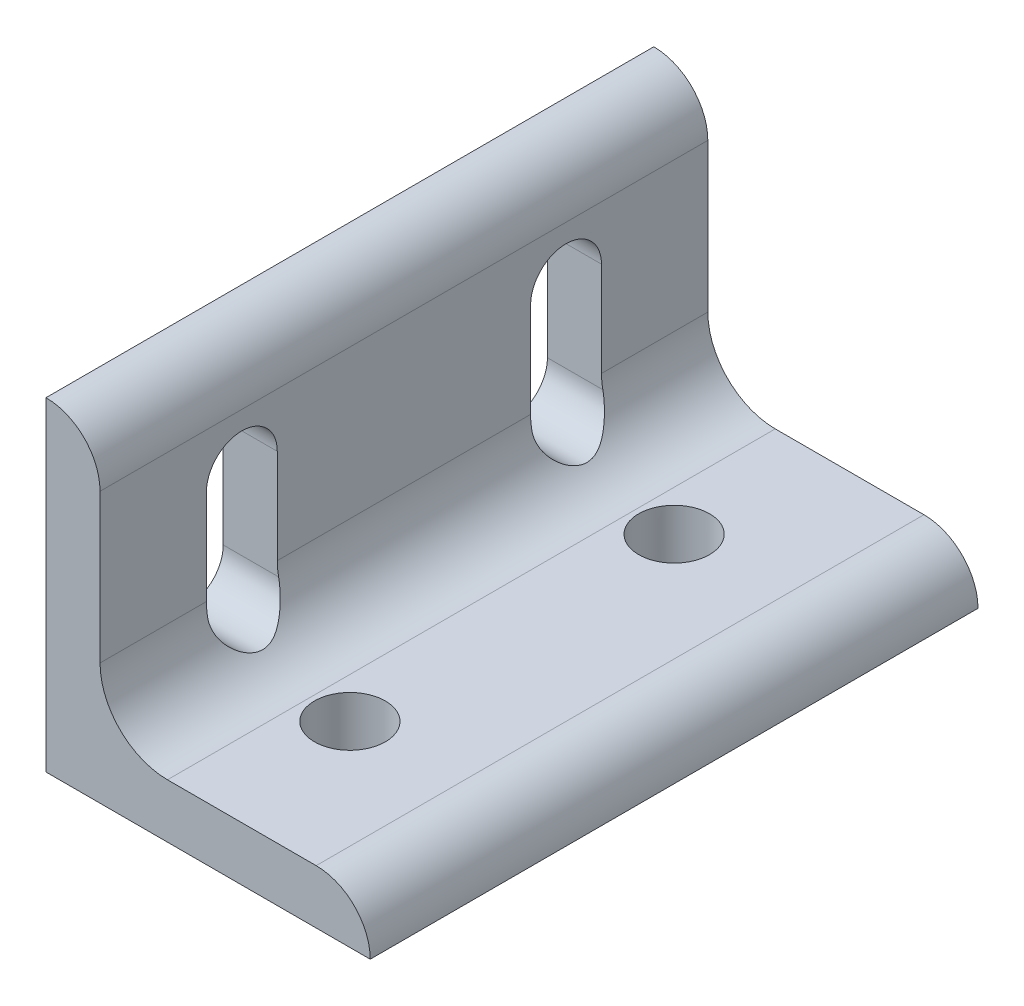
ISO-10303-21;
HEADER;
FILE_DESCRIPTION(('STEP AP214'),'2;1');
FILE_NAME('part.step','',(''),(''),'','','');
FILE_SCHEMA(('AUTOMOTIVE_DESIGN { 1 0 10303 214 1 1 1 1 }'));
ENDSEC;
DATA;
#1=APPLICATION_CONTEXT('core data for automotive mechanical design processes');
#2=APPLICATION_PROTOCOL_DEFINITION('international standard','automotive_design',2000,#1);
#3=PRODUCT_CONTEXT('',#1,'mechanical');
#4=PRODUCT('Part','Part','',(#3));
#5=PRODUCT_RELATED_PRODUCT_CATEGORY('part','',(#4));
#6=PRODUCT_DEFINITION_FORMATION('','',#4);
#7=PRODUCT_DEFINITION_CONTEXT('part definition',#1,'design');
#8=PRODUCT_DEFINITION('design','',#6,#7);
#9=PRODUCT_DEFINITION_SHAPE('','',#8);
#10=(LENGTH_UNIT() NAMED_UNIT(*) SI_UNIT(.MILLI.,.METRE.));
#11=(NAMED_UNIT(*) PLANE_ANGLE_UNIT() SI_UNIT($,.RADIAN.));
#12=(NAMED_UNIT(*) SI_UNIT($,.STERADIAN.) SOLID_ANGLE_UNIT());
#13=UNCERTAINTY_MEASURE_WITH_UNIT(LENGTH_MEASURE(1.E-05),#10,'distance_accuracy_value','');
#14=(GEOMETRIC_REPRESENTATION_CONTEXT(3) GLOBAL_UNCERTAINTY_ASSIGNED_CONTEXT((#13)) GLOBAL_UNIT_ASSIGNED_CONTEXT((#10,
#11,#12)) REPRESENTATION_CONTEXT('',''));
#15=CARTESIAN_POINT('',(0.,0.,0.));
#16=DIRECTION('',(0.,0.,1.));
#17=DIRECTION('',(1.,0.,0.));
#18=AXIS2_PLACEMENT_3D('',#15,#16,#17);
#19=CARTESIAN_POINT('',(38.1,0.,35.7124));
#20=DIRECTION('',(0.,1.,0.));
#21=DIRECTION('',(-1.,0.,0.));
#22=AXIS2_PLACEMENT_3D('',#19,#20,#21);
#23=PLANE('',#22);
#24=CARTESIAN_POINT('',(19.05,0.,-19.05));
#25=DIRECTION('',(0.,-1.,0.));
#26=DIRECTION('',(-1.,0.,0.));
#27=AXIS2_PLACEMENT_3D('',#24,#25,#26);
#28=CIRCLE('',#27,4.1656);
#29=CARTESIAN_POINT('',(14.8844,0.,-19.05));
#30=VERTEX_POINT('',#29);
#31=EDGE_CURVE('E449',#30,#30,#28,.T.);
#32=ORIENTED_EDGE('',*,*,#31,.F.);
#33=EDGE_LOOP('',(#32));
#34=FACE_BOUND('',#33,.T.);
#35=CARTESIAN_POINT('',(19.05,0.,19.05));
#36=DIRECTION('',(0.,-1.,0.));
#37=DIRECTION('',(1.,0.,0.));
#38=AXIS2_PLACEMENT_3D('',#35,#36,#37);
#39=CIRCLE('',#38,4.1656);
#40=CARTESIAN_POINT('',(23.2156,0.,19.05));
#41=VERTEX_POINT('',#40);
#42=EDGE_CURVE('E453',#41,#41,#39,.T.);
#43=ORIENTED_EDGE('',*,*,#42,.F.);
#44=EDGE_LOOP('',(#43));
#45=FACE_BOUND('',#44,.T.);
#46=DIRECTION('',(1.,0.,0.));
#47=VECTOR('',#46,1.);
#48=CARTESIAN_POINT('',(38.1,0.,-35.7124));
#49=LINE('',#48,#47);
#50=CARTESIAN_POINT('',(0.,0.,-35.7124));
#51=VERTEX_POINT('',#50);
#52=CARTESIAN_POINT('',(38.1,0.,-35.7124));
#53=VERTEX_POINT('',#52);
#54=EDGE_CURVE('E252',#51,#53,#49,.T.);
#55=ORIENTED_EDGE('',*,*,#54,.T.);
#56=DIRECTION('',(0.,0.,-1.));
#57=VECTOR('',#56,1.);
#58=CARTESIAN_POINT('',(38.1,0.,35.7124));
#59=LINE('',#58,#57);
#60=CARTESIAN_POINT('',(38.1,0.,35.7124));
#61=VERTEX_POINT('',#60);
#62=EDGE_CURVE('E290',#61,#53,#59,.T.);
#63=ORIENTED_EDGE('',*,*,#62,.F.);
#64=DIRECTION('',(1.,0.,0.));
#65=VECTOR('',#64,1.);
#66=CARTESIAN_POINT('',(38.1,0.,35.7124));
#67=LINE('',#66,#65);
#68=CARTESIAN_POINT('',(0.,0.,35.7124));
#69=VERTEX_POINT('',#68);
#70=EDGE_CURVE('E253',#69,#61,#67,.T.);
#71=ORIENTED_EDGE('',*,*,#70,.F.);
#72=DIRECTION('',(0.,0.,-1.));
#73=VECTOR('',#72,1.);
#74=CARTESIAN_POINT('',(0.,0.,35.7124));
#75=LINE('',#74,#73);
#76=EDGE_CURVE('E265',#69,#51,#75,.T.);
#77=ORIENTED_EDGE('',*,*,#76,.T.);
#78=EDGE_LOOP('',(#55,#63,#71,#77));
#79=FACE_BOUND('',#78,.T.);
#80=ADVANCED_FACE('F41',(#34,#45,#79),#23,.F.);
#81=CARTESIAN_POINT('',(14.2748,6.35,35.7124));
#82=DIRECTION('',(0.,-1.,0.));
#83=DIRECTION('',(1.,0.,0.));
#84=AXIS2_PLACEMENT_3D('',#81,#82,#83);
#85=PLANE('',#84);
#86=CARTESIAN_POINT('',(19.05,6.35,-19.05));
#87=DIRECTION('',(0.,-1.,0.));
#88=DIRECTION('',(1.,0.,0.));
#89=AXIS2_PLACEMENT_3D('',#86,#87,#88);
#90=CIRCLE('',#89,4.1656);
#91=CARTESIAN_POINT('',(23.2156,6.35,-19.05));
#92=VERTEX_POINT('',#91);
#93=EDGE_CURVE('E452',#92,#92,#90,.F.);
#94=ORIENTED_EDGE('',*,*,#93,.F.);
#95=EDGE_LOOP('',(#94));
#96=FACE_BOUND('',#95,.T.);
#97=CARTESIAN_POINT('',(19.05,6.35,19.05));
#98=DIRECTION('',(0.,-1.,0.));
#99=DIRECTION('',(1.,0.,0.));
#100=AXIS2_PLACEMENT_3D('',#97,#98,#99);
#101=CIRCLE('',#100,4.1656);
#102=CARTESIAN_POINT('',(23.2156,6.35,19.05));
#103=VERTEX_POINT('',#102);
#104=EDGE_CURVE('E456',#103,#103,#101,.F.);
#105=ORIENTED_EDGE('',*,*,#104,.F.);
#106=EDGE_LOOP('',(#105));
#107=FACE_BOUND('',#106,.T.);
#108=DIRECTION('',(-1.,0.,0.));
#109=VECTOR('',#108,1.);
#110=CARTESIAN_POINT('',(14.2748,6.35,35.7124));
#111=LINE('',#110,#109);
#112=CARTESIAN_POINT('',(31.75,6.35,35.7124));
#113=VERTEX_POINT('',#112);
#114=CARTESIAN_POINT('',(14.2748,6.35,35.7124));
#115=VERTEX_POINT('',#114);
#116=EDGE_CURVE('E255',#113,#115,#111,.T.);
#117=ORIENTED_EDGE('',*,*,#116,.F.);
#118=DIRECTION('',(0.,0.,-1.));
#119=VECTOR('',#118,1.);
#120=CARTESIAN_POINT('',(31.75,6.35,35.7124));
#121=LINE('',#120,#119);
#122=CARTESIAN_POINT('',(31.75,6.35,-35.7124));
#123=VERTEX_POINT('',#122);
#124=EDGE_CURVE('E293',#113,#123,#121,.T.);
#125=ORIENTED_EDGE('',*,*,#124,.T.);
#126=DIRECTION('',(-1.,0.,0.));
#127=VECTOR('',#126,1.);
#128=CARTESIAN_POINT('',(14.2748,6.35,-35.7124));
#129=LINE('',#128,#127);
#130=CARTESIAN_POINT('',(14.2748,6.35,-35.7124));
#131=VERTEX_POINT('',#130);
#132=EDGE_CURVE('E268',#123,#131,#129,.T.);
#133=ORIENTED_EDGE('',*,*,#132,.T.);
#134=DIRECTION('',(0.,0.,-1.));
#135=VECTOR('',#134,1.);
#136=CARTESIAN_POINT('',(14.2748,6.35,35.7124));
#137=LINE('',#136,#135);
#138=EDGE_CURVE('E286',#115,#131,#137,.T.);
#139=ORIENTED_EDGE('',*,*,#138,.F.);
#140=EDGE_LOOP('',(#117,#125,#133,#139));
#141=FACE_BOUND('',#140,.T.);
#142=ADVANCED_FACE('F311',(#96,#107,#141),#85,.F.);
#143=CARTESIAN_POINT('',(14.2748,14.2748,35.7124));
#144=DIRECTION('',(0.,0.,-1.));
#145=DIRECTION('',(-1.,0.,0.));
#146=AXIS2_PLACEMENT_3D('',#143,#144,#145);
#147=CYLINDRICAL_SURFACE('',#146,7.9248);
#148=DIRECTION('',(0.,0.,-1.));
#149=VECTOR('',#148,1.);
#150=CARTESIAN_POINT('',(6.34999999999999,14.2748,35.7124));
#151=LINE('',#150,#149);
#152=CARTESIAN_POINT('',(6.34999999999999,14.2748,14.8844));
#153=VERTEX_POINT('',#152);
#154=CARTESIAN_POINT('',(6.34999999999999,14.2748,-14.8844));
#155=VERTEX_POINT('',#154);
#156=EDGE_CURVE('E287',#153,#155,#151,.T.);
#157=ORIENTED_EDGE('',*,*,#156,.F.);
#158=CARTESIAN_POINT('',(14.2748,14.2748,14.8844));
#159=DIRECTION('',(0.,0.,-1.));
#160=DIRECTION('',(0.,1.,0.));
#161=AXIS2_PLACEMENT_3D('',#158,#159,#160);
#162=CIRCLE('',#161,7.9248);
#163=CARTESIAN_POINT('',(6.5080464954783,12.7,14.8844));
#164=VERTEX_POINT('',#163);
#165=EDGE_CURVE('E196',#153,#164,#162,.F.);
#166=ORIENTED_EDGE('',*,*,#165,.T.);
#167=CARTESIAN_POINT('',(6.5080464954783,12.7,14.8844));
#168=CARTESIAN_POINT('',(6.53163220274449,12.5835580765924,14.8843825946476));
#169=CARTESIAN_POINT('',(6.55787464961568,12.4676933434238,14.8892812305706));
#170=CARTESIAN_POINT('',(6.61528756573018,12.2380828578918,14.9084933545678));
#171=CARTESIAN_POINT('',(6.64645382103028,12.1243353857246,14.9227988247977));
#172=CARTESIAN_POINT('',(6.71314980276589,11.9004629020729,14.9602848365277));
#173=CARTESIAN_POINT('',(6.7486494217396,11.7903189589891,14.9834062725247));
#174=CARTESIAN_POINT('',(6.82369749415313,11.5735592761762,15.0380355885587));
#175=CARTESIAN_POINT('',(6.86324671770908,11.4669442126567,15.0695450655848));
#176=CARTESIAN_POINT('',(6.98693094869242,11.1539873654591,15.1756713418119));
#177=CARTESIAN_POINT('',(7.07638533753304,10.9536021930046,15.2620485611866));
#178=CARTESIAN_POINT('',(7.2650354324518,10.5719346004298,15.4624901689419));
#179=CARTESIAN_POINT('',(7.36425083064592,10.3906923921382,15.5766112397867));
#180=CARTESIAN_POINT('',(7.58001868893748,10.0283860031617,15.8450658101959));
#181=CARTESIAN_POINT('',(7.69720346524856,9.85008010781652,16.0026173727723));
#182=CARTESIAN_POINT('',(7.93007233129112,9.52219145004703,16.3462624516259));
#183=CARTESIAN_POINT('',(8.0457562927494,9.37261112788442,16.5323583903586));
#184=CARTESIAN_POINT('',(8.24850232099302,9.12625896600256,16.9002274807985));
#185=CARTESIAN_POINT('',(8.33719389505683,9.02487422812994,17.0780050718483));
#186=CARTESIAN_POINT('',(8.4989525809093,8.84742149049866,17.4523223588624));
#187=CARTESIAN_POINT('',(8.57204872023771,8.77130630738446,17.6488261956366));
#188=CARTESIAN_POINT('',(8.67959197113028,8.66225688177178,18.0125125432324));
#189=CARTESIAN_POINT('',(8.71902533273092,8.62347457603909,18.1764373644391));
#190=CARTESIAN_POINT('',(8.77817530674137,8.56591907001296,18.5111756559129));
#191=CARTESIAN_POINT('',(8.79791886349327,8.54711852353129,18.6819793786624));
#192=CARTESIAN_POINT('',(8.81493669321511,8.53088867576542,19.0264474931752));
#193=CARTESIAN_POINT('',(8.81212242931867,8.53354358502665,19.2001204844643));
#194=CARTESIAN_POINT('',(8.78425424330876,8.56019683034548,19.5440419662538));
#195=CARTESIAN_POINT('',(8.75918097684411,8.58421373123497,19.7142873463241));
#196=CARTESIAN_POINT('',(8.68418406210569,8.65780369031964,20.0760127603882));
#197=CARTESIAN_POINT('',(8.63066424196056,8.71112980332612,20.2659585659389));
#198=CARTESIAN_POINT('',(8.5052584919694,8.84129823674258,20.6312737039262));
#199=CARTESIAN_POINT('',(8.43333498813348,8.91818873177569,20.806612230773));
#200=CARTESIAN_POINT('',(8.30384494130255,9.06363018103847,21.0859272444735));
#201=CARTESIAN_POINT('',(8.24936632169106,9.12656845322995,21.1943678775478));
#202=CARTESIAN_POINT('',(8.13704224540913,9.26101430957051,21.4039538019596));
#203=CARTESIAN_POINT('',(8.07919684156867,9.33252175927477,21.5050992077146));
#204=CARTESIAN_POINT('',(7.96154748114299,9.4837155209309,21.7000904969428));
#205=CARTESIAN_POINT('',(7.90174105435643,9.56341244113339,21.7939266287005));
#206=CARTESIAN_POINT('',(7.78151020507391,9.73054656283487,21.9739792275622));
#207=CARTESIAN_POINT('',(7.72108583904725,9.8179830625586,22.0601963840921));
#208=CARTESIAN_POINT('',(7.59974547611755,10.0018115278443,22.2260953227102));
#209=CARTESIAN_POINT('',(7.53883775067407,10.0983271819743,22.3056462184466));
#210=CARTESIAN_POINT('',(7.41862125240691,10.2987564408494,22.4561644336177));
#211=CARTESIAN_POINT('',(7.35931232315556,10.4026693181952,22.5271325951809));
#212=CARTESIAN_POINT('',(7.24346608950344,10.6172568575747,22.6597459049358));
#213=CARTESIAN_POINT('',(7.18692136875626,10.7279114076557,22.7214170434374));
#214=CARTESIAN_POINT('',(7.07738622979663,10.9558134721982,22.8350025176819));
#215=CARTESIAN_POINT('',(7.02439578879453,11.0730609443779,22.8869169159877));
#216=CARTESIAN_POINT('',(6.92466825089226,11.3093524254135,22.9785891784197));
#217=CARTESIAN_POINT('',(6.87777747044407,11.4281909862074,23.0187080223185));
#218=CARTESIAN_POINT('',(6.78896300700549,11.6706923096469,23.0883985310368));
#219=CARTESIAN_POINT('',(6.74703777411184,11.7943535508775,23.1179734927574));
#220=CARTESIAN_POINT('',(6.66850733292112,12.0467219375613,23.1660749340771));
#221=CARTESIAN_POINT('',(6.63195239223434,12.1754640074441,23.1845015058762));
#222=CARTESIAN_POINT('',(6.56512440811821,12.4358810439194,23.209286351876));
#223=CARTESIAN_POINT('',(6.5348595974061,12.567559607526,23.2156288976503));
#224=CARTESIAN_POINT('',(6.5080464954783,12.7,23.2156));
#225=B_SPLINE_CURVE_WITH_KNOTS('',3,(#167,#168,#169,#170,#171,#172,#173,#174,#175,#176,#177,
#178,#179,#180,#181,#182,#183,#184,#185,#186,#187,#188,#189,#190,#191,#192,#193,#194,#195,#196,
#197,#198,#199,#200,#201,#202,#203,#204,#205,#206,#207,#208,#209,#210,#211,#212,#213,#214,#215,
#216,#217,#218,#219,#220,#221,#222,#223,#224),.UNSPECIFIED.,.F.,.F.,(4,2,2,2,2,2,2,2,2,2,2,2,2,
2,2,2,2,2,2,2,2,2,2,2,2,2,2,2,4),(0.,0.356230564600409,0.712157891644704,1.06573975483689,
1.41938898426376,2.12376165412193,2.82958567821203,3.62213731146314,4.41475624289144,
5.08166429224454,5.7473199927577,6.2642562943707,6.7804842243145,7.29873927905101,
7.81744516857058,8.42741656536717,9.03864339127069,9.44829000204644,9.85793018657466,
10.2681078534863,10.6782483661515,11.0951378285751,11.5119863530162,11.9276470386122,
12.3433050587821,12.7444590989697,13.145487594549,13.5500586889426,13.955156009535),.UNSPECIFIED.);
#226=CARTESIAN_POINT('',(6.5080464954783,12.7,23.2156));
#227=VERTEX_POINT('',#226);
#228=EDGE_CURVE('E199',#164,#227,#225,.T.);
#229=ORIENTED_EDGE('',*,*,#228,.T.);
#230=CARTESIAN_POINT('',(14.2748,14.2748,23.2156));
#231=DIRECTION('',(0.,0.,1.));
#232=DIRECTION('',(0.,-1.,0.));
#233=AXIS2_PLACEMENT_3D('',#230,#231,#232);
#234=CIRCLE('',#233,7.9248);
#235=CARTESIAN_POINT('',(6.34999999999999,14.2748,23.2156));
#236=VERTEX_POINT('',#235);
#237=EDGE_CURVE('E189',#227,#236,#234,.F.);
#238=ORIENTED_EDGE('',*,*,#237,.T.);
#239=CARTESIAN_POINT('',(6.34999999999999,14.2748,35.7124));
#240=VERTEX_POINT('',#239);
#241=EDGE_CURVE('E283',#240,#236,#151,.T.);
#242=ORIENTED_EDGE('',*,*,#241,.F.);
#243=CARTESIAN_POINT('',(14.2748,14.2748,35.7124));
#244=DIRECTION('',(0.,0.,-1.));
#245=DIRECTION('',(1.,0.,0.));
#246=AXIS2_PLACEMENT_3D('',#243,#244,#245);
#247=CIRCLE('',#246,7.9248);
#248=EDGE_CURVE('E258',#115,#240,#247,.T.);
#249=ORIENTED_EDGE('',*,*,#248,.F.);
#250=ORIENTED_EDGE('',*,*,#138,.T.);
#251=CARTESIAN_POINT('',(14.2748,14.2748,-35.7124));
#252=DIRECTION('',(0.,0.,-1.));
#253=DIRECTION('',(1.,0.,0.));
#254=AXIS2_PLACEMENT_3D('',#251,#252,#253);
#255=CIRCLE('',#254,7.9248);
#256=CARTESIAN_POINT('',(6.34999999999999,14.2748,-35.7124));
#257=VERTEX_POINT('',#256);
#258=EDGE_CURVE('E270',#131,#257,#255,.T.);
#259=ORIENTED_EDGE('',*,*,#258,.T.);
#260=CARTESIAN_POINT('',(6.34999999999999,14.2748,-23.2156));
#261=VERTEX_POINT('',#260);
#262=EDGE_CURVE('E282',#261,#257,#151,.T.);
#263=ORIENTED_EDGE('',*,*,#262,.F.);
#264=CARTESIAN_POINT('',(14.2748,14.2748,-23.2156));
#265=DIRECTION('',(0.,0.,-1.));
#266=DIRECTION('',(-1.,0.,0.));
#267=AXIS2_PLACEMENT_3D('',#264,#265,#266);
#268=CIRCLE('',#267,7.9248);
#269=CARTESIAN_POINT('',(6.5080464954783,12.7,-23.2156));
#270=VERTEX_POINT('',#269);
#271=EDGE_CURVE('E242',#261,#270,#268,.F.);
#272=ORIENTED_EDGE('',*,*,#271,.T.);
#273=CARTESIAN_POINT('',(6.34999999999999,14.2748,-15.1935471842638));
#274=CARTESIAN_POINT('',(6.34999840558493,14.3802881475093,-15.2366215495903));
#275=CARTESIAN_POINT('',(6.35210942734281,14.4839824927736,-15.284021153123));
#276=CARTESIAN_POINT('',(6.36007815539498,14.687057837317,-15.3871062360648));
#277=CARTESIAN_POINT('',(6.36593689151154,14.7864376429998,-15.4427939897194));
#278=CARTESIAN_POINT('',(6.38086055122352,14.9802291210777,-15.5620587376491));
#279=CARTESIAN_POINT('',(6.38992873706398,15.0746356257723,-15.6256437162148));
#280=CARTESIAN_POINT('',(6.41065760861694,15.2577680895732,-15.760170775138));
#281=CARTESIAN_POINT('',(6.42231935323452,15.3464917093443,-15.8311158541666));
#282=CARTESIAN_POINT('',(6.46013564248902,15.6026275989014,-16.053682623636));
#283=CARTESIAN_POINT('',(6.48919929421847,15.76088113086,-16.2155776852476));
#284=CARTESIAN_POINT('',(6.54972166437314,16.0488808109224,-16.5624071619995));
#285=CARTESIAN_POINT('',(6.58118033244864,16.1786275580934,-16.7473410928523));
#286=CARTESIAN_POINT('',(6.64256936452449,16.4117844710463,-17.1446948785586));
#287=CARTESIAN_POINT('',(6.67237194425031,16.5137878465732,-17.3579651273906));
#288=CARTESIAN_POINT('',(6.72345725072713,16.6804919598838,-17.7995706410265));
#289=CARTESIAN_POINT('',(6.74474242144146,16.745203400468,-18.0279015624241));
#290=CARTESIAN_POINT('',(6.77447172312349,16.8340407890897,-18.488152756479));
#291=CARTESIAN_POINT('',(6.78317790950425,16.8589961377781,-18.7198949892706));
#292=CARTESIAN_POINT('',(6.78694726089812,16.869904392374,-19.1843771145545));
#293=CARTESIAN_POINT('',(6.78201354070597,16.8558662028015,-19.4171167671582));
#294=CARTESIAN_POINT('',(6.75995102890689,16.7908611253881,-19.8663021293573));
#295=CARTESIAN_POINT('',(6.7433638343573,16.7415325655002,-20.0830156631022));
#296=CARTESIAN_POINT('',(6.70138425886123,16.609449430855,-20.5051118940915));
#297=CARTESIAN_POINT('',(6.67598969426011,16.5266865657262,-20.7104917666743));
#298=CARTESIAN_POINT('',(6.61960893812246,16.3270127832679,-21.1112430320897));
#299=CARTESIAN_POINT('',(6.58847229528651,16.2091118536111,-21.3060981651194));
#300=CARTESIAN_POINT('',(6.52638095626817,15.9430445887218,-21.6741965781238));
#301=CARTESIAN_POINT('',(6.49542632218263,15.7948684781694,-21.8474328485764));
#302=CARTESIAN_POINT('',(6.45271324374676,15.5494390683795,-22.0908817115024));
#303=CARTESIAN_POINT('',(6.43886753501248,15.4618388069226,-22.1706623591336));
#304=CARTESIAN_POINT('',(6.41347091525403,15.2799746886198,-22.3226092630975));
#305=CARTESIAN_POINT('',(6.40191905762037,15.1857136023787,-22.3947786545977));
#306=CARTESIAN_POINT('',(6.38183684363064,14.9911479132762,-22.5309438347354));
#307=CARTESIAN_POINT('',(6.37330674339227,14.8908427989784,-22.594938930243));
#308=CARTESIAN_POINT('',(6.3599508899481,14.6849805241208,-22.7141798107802));
#309=CARTESIAN_POINT('',(6.35512327276629,14.579426034843,-22.7694299872134));
#310=CARTESIAN_POINT('',(6.34989456956659,14.3690004600355,-22.868314682011));
#311=CARTESIAN_POINT('',(6.34929416587962,14.2643349518262,-22.9123762052846));
#312=CARTESIAN_POINT('',(6.3524245902709,14.0518550097385,-22.9917720219277));
#313=CARTESIAN_POINT('',(6.35615344767702,13.944042030354,-23.0271102772375));
#314=CARTESIAN_POINT('',(6.3682615609201,13.7261603351646,-23.0888160361672));
#315=CARTESIAN_POINT('',(6.37663969375868,13.616092170264,-23.1151857036038));
#316=CARTESIAN_POINT('',(6.39824301638088,13.3946398740466,-23.1588240664792));
#317=CARTESIAN_POINT('',(6.41146797126149,13.2832558067585,-23.1760932028798));
#318=CARTESIAN_POINT('',(6.44172569688593,13.0680011672603,-23.2006251402703));
#319=CARTESIAN_POINT('',(6.45842472218773,12.9641538699196,-23.208506972613));
#320=CARTESIAN_POINT('',(6.49600941571756,12.75690906789,-23.2165042611073));
#321=CARTESIAN_POINT('',(6.51689644882589,12.6535117210941,-23.2166171812149));
#322=CARTESIAN_POINT('',(6.58564729330688,12.3451491747233,-23.2055390425699));
#323=CARTESIAN_POINT('',(6.63962682289253,12.1418286291668,-23.1829513726974));
#324=CARTESIAN_POINT('',(6.76327750561046,11.740067143322,-23.1087690001081));
#325=CARTESIAN_POINT('',(6.83330281270359,11.5418702043195,-23.0564726678153));
#326=CARTESIAN_POINT('',(6.98518904721734,11.1592878546871,-22.9254779555919));
#327=CARTESIAN_POINT('',(7.0670526622386,10.9749055948142,-22.8467735749832));
#328=CARTESIAN_POINT('',(7.25036553117401,10.5993465034363,-22.6541198633406));
#329=CARTESIAN_POINT('',(7.35297677546978,10.410417869139,-22.5369132691981));
#330=CARTESIAN_POINT('',(7.56370486917045,10.0550397932995,-22.2757006454469));
#331=CARTESIAN_POINT('',(7.6718301643863,9.88862635439048,-22.1316525494428));
#332=CARTESIAN_POINT('',(7.84172970050784,9.64555741232373,-21.8852487520489));
#333=CARTESIAN_POINT('',(7.90377263935615,9.56070036977746,-21.7910156404977));
#334=CARTESIAN_POINT('',(8.02631389219229,9.39944187840372,-21.594542568338));
#335=CARTESIAN_POINT('',(8.08681178806399,9.32304270015642,-21.4923004701723));
#336=CARTESIAN_POINT('',(8.20461782196976,9.17931494880473,-21.2801104153213));
#337=CARTESIAN_POINT('',(8.26193000809256,9.11197470236412,-21.1701726586234));
#338=CARTESIAN_POINT('',(8.37158252529364,8.98694686750839,-20.9427000258152));
#339=CARTESIAN_POINT('',(8.42392564660973,8.92925384794049,-20.8251694762835));
#340=CARTESIAN_POINT('',(8.53698099313113,8.80773698493657,-20.5442172893856));
#341=CARTESIAN_POINT('',(8.59512219234174,8.74772315526475,-20.3780174453836));
#342=CARTESIAN_POINT('',(8.66880756942026,8.6733245596634,-20.1205598916371));
#343=CARTESIAN_POINT('',(8.69111011459066,8.65113320217559,-20.0334094947036));
#344=CARTESIAN_POINT('',(8.73052619893434,8.61226972541861,-19.8567529374508));
#345=CARTESIAN_POINT('',(8.74764240852037,8.59559476538247,-19.767248015353));
#346=CARTESIAN_POINT('',(8.77620765690773,8.56793222212671,-19.5855115812885));
#347=CARTESIAN_POINT('',(8.78759754771643,8.55700394627556,-19.4932616362449));
#348=CARTESIAN_POINT('',(8.80396892269039,8.54133754900536,-19.3077087724825));
#349=CARTESIAN_POINT('',(8.80895339587444,8.53659654034897,-19.2144063654034));
#350=CARTESIAN_POINT('',(8.81229679378166,8.53341328479125,-19.0275694310592));
#351=CARTESIAN_POINT('',(8.81065574671526,8.53497101107089,-18.9340349047841));
#352=CARTESIAN_POINT('',(8.8008351608761,8.54433737735404,-18.7476535561227));
#353=CARTESIAN_POINT('',(8.79265590534613,8.55214574657246,-18.6548067041214));
#354=CARTESIAN_POINT('',(8.7615905614118,8.582017484092,-18.4013415092053));
#355=CARTESIAN_POINT('',(8.73227290628397,8.61038226539292,-18.2421878636155));
#356=CARTESIAN_POINT('',(8.65792785955027,8.68410206044297,-17.9318034839121));
#357=CARTESIAN_POINT('',(8.61288533886279,8.72947343955189,-17.7805805417689));
#358=CARTESIAN_POINT('',(8.48671389835745,8.86072567344351,-17.4174462987741));
#359=CARTESIAN_POINT('',(8.39863384447213,8.95560065883072,-17.2111578469083));
#360=CARTESIAN_POINT('',(8.25607034969275,9.11896431279083,-16.9190560359531));
#361=CARTESIAN_POINT('',(8.20673726550831,9.17701711190773,-16.8244649805895));
#362=CARTESIAN_POINT('',(8.10567865664265,9.29979052418622,-16.6410662326572));
#363=CARTESIAN_POINT('',(8.0539533773582,9.3645104542508,-16.5522579491194));
#364=CARTESIAN_POINT('',(7.89396385324378,9.57179505569486,-16.2900965387944));
#365=CARTESIAN_POINT('',(7.78343495808852,9.72466030827906,-16.1260275661361));
#366=CARTESIAN_POINT('',(7.61887967383592,9.97234865791848,-15.8996581888724));
#367=CARTESIAN_POINT('',(7.56421582805345,10.0580088668633,-15.8274694981054));
#368=CARTESIAN_POINT('',(7.4559943499843,10.2353552354051,-15.6898894477887));
#369=CARTESIAN_POINT('',(7.40243688941368,10.3270423213023,-15.6244991371212));
#370=CARTESIAN_POINT('',(7.28878821650628,10.5312921716686,-15.4910543094338));
#371=CARTESIAN_POINT('',(7.22901972184296,10.6448502084967,-15.4242424242747));
#372=CARTESIAN_POINT('',(7.11313012141269,10.8792120747186,-15.3010711239293));
#373=CARTESIAN_POINT('',(7.05700753843686,11.0000129309168,-15.2447074580786));
#374=CARTESIAN_POINT('',(6.9494489712005,11.2482540683929,-15.1432582730027));
#375=CARTESIAN_POINT('',(6.89801227730409,11.3756933397323,-15.0981710442511));
#376=CARTESIAN_POINT('',(6.80082440248851,11.6363395975801,-15.0201933619079));
#377=CARTESIAN_POINT('',(6.75507188628777,11.7695452195515,-14.9873000402055));
#378=CARTESIAN_POINT('',(6.67509903659173,12.0247464538044,-14.9376860068759));
#379=CARTESIAN_POINT('',(6.64015600321549,12.1462363327321,-14.91952599536));
#380=CARTESIAN_POINT('',(6.57591175857078,12.3918042120175,-14.8939838344601));
#381=CARTESIAN_POINT('',(6.54660937298308,12.5158816676962,-14.8865994396032));
#382=CARTESIAN_POINT('',(6.49405947090977,12.7652516247067,-14.8830485746382));
#383=CARTESIAN_POINT('',(6.47080126391321,12.8905415685471,-14.8868621493273));
#384=CARTESIAN_POINT('',(6.43047052787466,13.1411933744665,-14.9059238531168));
#385=CARTESIAN_POINT('',(6.41339557596341,13.2665551890553,-14.9211674962121));
#386=CARTESIAN_POINT('',(6.38250330239289,13.5419559033426,-14.967518771727));
#387=CARTESIAN_POINT('',(6.37009690906087,13.6917182526147,-15.0012616510834));
#388=CARTESIAN_POINT('',(6.35384675437623,13.9870076545871,-15.0852308971041));
#389=CARTESIAN_POINT('',(6.35000215028198,14.1325351227373,-15.135455640891));
#390=CARTESIAN_POINT('',(6.34999999999999,14.2748,-15.1935471842638));
#391=B_SPLINE_CURVE_WITH_KNOTS('',3,(#273,#274,#275,#276,#277,#278,#279,#280,#281,#282,#283,
#284,#285,#286,#287,#288,#289,#290,#291,#292,#293,#294,#295,#296,#297,#298,#299,#300,#301,#302,
#303,#304,#305,#306,#307,#308,#309,#310,#311,#312,#313,#314,#315,#316,#317,#318,#319,#320,#321,
#322,#323,#324,#325,#326,#327,#328,#329,#330,#331,#332,#333,#334,#335,#336,#337,#338,#339,#340,
#341,#342,#343,#344,#345,#346,#347,#348,#349,#350,#351,#352,#353,#354,#355,#356,#357,#358,#359,
#360,#361,#362,#363,#364,#365,#366,#367,#368,#369,#370,#371,#372,#373,#374,#375,#376,#377,#378,
#379,#380,#381,#382,#383,#384,#385,#386,#387,#388,#389,#390),.UNSPECIFIED.,.T.,.F.,(4,2,2,2,2,2,
2,2,2,2,2,2,2,2,2,2,2,2,2,2,2,2,2,2,2,2,2,2,2,2,2,2,2,2,2,2,2,2,2,2,2,2,2,2,2,2,2,2,2,2,2,2,2,2,
2,2,2,2,4),(0.,0.341675509859117,0.683444947977188,1.02556278006015,1.3678205501915,
2.04927482226686,2.73071477228181,3.44208014233571,4.1532412484314,4.84936196667053,
5.54532373264479,6.2109132795909,6.87666796754228,7.56331273631981,8.25017956188958,
8.60767990328753,8.96503240608256,9.32241519006918,9.67961793514596,10.0198580734097,
10.3599433956553,10.6999466085188,11.0399333451802,11.3559772079712,11.6721242380093,
12.3038619967656,12.9511795877492,13.5986443678757,14.330521993769,15.0635564261167,
15.4866628053522,15.9098824967813,16.3325514938943,16.7549817316751,17.3107097931205,
17.5884008603206,17.8659487021533,18.1463073255261,18.4265350750193,18.7067616313482,
18.9869760485948,19.4776133915583,19.9687240894523,20.6950524808733,21.0591698819406,
21.4232500135139,22.1701318300413,22.5438276644829,22.9175810689715,23.3510307936339,
23.7843037884264,24.2175110584522,24.6506163696915,25.0331820216693,25.4156679414519,
25.7974726708386,26.1791276301654,26.6399681213299,27.1007632497066),.UNSPECIFIED.);
#392=CARTESIAN_POINT('',(6.5080464954783,12.7,-14.8844));
#393=VERTEX_POINT('',#392);
#394=EDGE_CURVE('E234',#270,#393,#391,.T.);
#395=ORIENTED_EDGE('',*,*,#394,.T.);
#396=CARTESIAN_POINT('',(14.2748,14.2748,-14.8844));
#397=DIRECTION('',(0.,0.,1.));
#398=DIRECTION('',(0.,-1.,0.));
#399=AXIS2_PLACEMENT_3D('',#396,#397,#398);
#400=CIRCLE('',#399,7.9248);
#401=EDGE_CURVE('E246',#393,#155,#400,.F.);
#402=ORIENTED_EDGE('',*,*,#401,.T.);
#403=EDGE_LOOP('',(#157,#166,#229,#238,#242,#249,#250,#259,#263,#272,#395,#402));
#404=FACE_BOUND('',#403,.T.);
#405=ADVANCED_FACE('F210',(#404),#147,.F.);
#406=CARTESIAN_POINT('',(6.34999999999999,38.1,35.7124));
#407=DIRECTION('',(-1.,0.,0.));
#408=DIRECTION('',(0.,-1.,0.));
#409=AXIS2_PLACEMENT_3D('',#406,#407,#408);
#410=PLANE('',#409);
#411=CARTESIAN_POINT('',(6.34999999999999,25.4,19.05));
#412=DIRECTION('',(-1.,0.,0.));
#413=DIRECTION('',(0.,-1.,0.));
#414=AXIS2_PLACEMENT_3D('',#411,#412,#413);
#415=CIRCLE('',#414,4.1656);
#416=CARTESIAN_POINT('',(6.34999999999999,25.4,23.2156));
#417=VERTEX_POINT('',#416);
#418=CARTESIAN_POINT('',(6.34999999999999,25.4,14.8844));
#419=VERTEX_POINT('',#418);
#420=EDGE_CURVE('E165',#417,#419,#415,.T.);
#421=ORIENTED_EDGE('',*,*,#420,.T.);
#422=DIRECTION('',(0.,-1.,0.));
#423=VECTOR('',#422,1.);
#424=CARTESIAN_POINT('',(6.34999999999999,38.1,14.8844));
#425=LINE('',#424,#423);
#426=EDGE_CURVE('E193',#419,#153,#425,.T.);
#427=ORIENTED_EDGE('',*,*,#426,.T.);
#428=ORIENTED_EDGE('',*,*,#156,.T.);
#429=DIRECTION('',(0.,1.,0.));
#430=VECTOR('',#429,1.);
#431=CARTESIAN_POINT('',(6.34999999999999,38.1,-14.8844));
#432=LINE('',#431,#430);
#433=CARTESIAN_POINT('',(6.34999999999999,25.4,-14.8844));
#434=VERTEX_POINT('',#433);
#435=EDGE_CURVE('E241',#155,#434,#432,.T.);
#436=ORIENTED_EDGE('',*,*,#435,.T.);
#437=CARTESIAN_POINT('',(6.34999999999999,25.4,-19.05));
#438=DIRECTION('',(-1.,0.,0.));
#439=DIRECTION('',(0.,-1.,0.));
#440=AXIS2_PLACEMENT_3D('',#437,#438,#439);
#441=CIRCLE('',#440,4.1656);
#442=CARTESIAN_POINT('',(6.34999999999999,25.4,-23.2156));
#443=VERTEX_POINT('',#442);
#444=EDGE_CURVE('E249',#434,#443,#441,.T.);
#445=ORIENTED_EDGE('',*,*,#444,.T.);
#446=DIRECTION('',(0.,-1.,0.));
#447=VECTOR('',#446,1.);
#448=CARTESIAN_POINT('',(6.34999999999999,38.1,-23.2156));
#449=LINE('',#448,#447);
#450=EDGE_CURVE('E348',#443,#261,#449,.T.);
#451=ORIENTED_EDGE('',*,*,#450,.T.);
#452=ORIENTED_EDGE('',*,*,#262,.T.);
#453=DIRECTION('',(0.,1.,0.));
#454=VECTOR('',#453,1.);
#455=CARTESIAN_POINT('',(6.34999999999999,38.1,-35.7124));
#456=LINE('',#455,#454);
#457=CARTESIAN_POINT('',(6.34999999999999,31.75,-35.7124));
#458=VERTEX_POINT('',#457);
#459=EDGE_CURVE('E273',#257,#458,#456,.T.);
#460=ORIENTED_EDGE('',*,*,#459,.T.);
#461=DIRECTION('',(0.,0.,-1.));
#462=VECTOR('',#461,1.);
#463=CARTESIAN_POINT('',(6.34999999999999,31.75,35.7124));
#464=LINE('',#463,#462);
#465=CARTESIAN_POINT('',(6.34999999999999,31.75,35.7124));
#466=VERTEX_POINT('',#465);
#467=EDGE_CURVE('E11',#458,#466,#464,.F.);
#468=ORIENTED_EDGE('',*,*,#467,.T.);
#469=DIRECTION('',(0.,1.,0.));
#470=VECTOR('',#469,1.);
#471=CARTESIAN_POINT('',(6.34999999999999,38.1,35.7124));
#472=LINE('',#471,#470);
#473=EDGE_CURVE('E260',#240,#466,#472,.T.);
#474=ORIENTED_EDGE('',*,*,#473,.F.);
#475=ORIENTED_EDGE('',*,*,#241,.T.);
#476=DIRECTION('',(0.,1.,0.));
#477=VECTOR('',#476,1.);
#478=CARTESIAN_POINT('',(6.34999999999999,38.1,23.2156));
#479=LINE('',#478,#477);
#480=EDGE_CURVE('E185',#236,#417,#479,.T.);
#481=ORIENTED_EDGE('',*,*,#480,.T.);
#482=EDGE_LOOP('',(#421,#427,#428,#436,#445,#451,#452,#460,#468,#474,#475,#481));
#483=FACE_BOUND('',#482,.T.);
#484=ADVANCED_FACE('F329',(#483),#410,.F.);
#485=CARTESIAN_POINT('',(0.,0.,35.7124));
#486=DIRECTION('',(1.,0.,0.));
#487=DIRECTION('',(0.,1.,0.));
#488=AXIS2_PLACEMENT_3D('',#485,#486,#487);
#489=PLANE('',#488);
#490=DIRECTION('',(0.,1.,0.));
#491=VECTOR('',#490,1.);
#492=CARTESIAN_POINT('',(0.,25.4,23.2156));
#493=LINE('',#492,#491);
#494=CARTESIAN_POINT('',(0.,12.7,23.2156));
#495=VERTEX_POINT('',#494);
#496=CARTESIAN_POINT('',(0.,25.4,23.2156));
#497=VERTEX_POINT('',#496);
#498=EDGE_CURVE('E171',#495,#497,#493,.T.);
#499=ORIENTED_EDGE('',*,*,#498,.F.);
#500=CARTESIAN_POINT('',(0.,12.7,19.05));
#501=DIRECTION('',(-1.,0.,0.));
#502=DIRECTION('',(0.,1.,0.));
#503=AXIS2_PLACEMENT_3D('',#500,#501,#502);
#504=CIRCLE('',#503,4.1656);
#505=CARTESIAN_POINT('',(0.,12.7,14.8844));
#506=VERTEX_POINT('',#505);
#507=EDGE_CURVE('E64',#506,#495,#504,.T.);
#508=ORIENTED_EDGE('',*,*,#507,.F.);
#509=DIRECTION('',(0.,-1.,0.));
#510=VECTOR('',#509,1.);
#511=CARTESIAN_POINT('',(0.,12.7,14.8844));
#512=LINE('',#511,#510);
#513=CARTESIAN_POINT('',(0.,25.4,14.8844));
#514=VERTEX_POINT('',#513);
#515=EDGE_CURVE('E178',#514,#506,#512,.T.);
#516=ORIENTED_EDGE('',*,*,#515,.F.);
#517=CARTESIAN_POINT('',(0.,25.4,19.05));
#518=DIRECTION('',(-1.,0.,0.));
#519=DIRECTION('',(0.,1.,0.));
#520=AXIS2_PLACEMENT_3D('',#517,#518,#519);
#521=CIRCLE('',#520,4.1656);
#522=EDGE_CURVE('E162',#497,#514,#521,.T.);
#523=ORIENTED_EDGE('',*,*,#522,.F.);
#524=EDGE_LOOP('',(#499,#508,#516,#523));
#525=FACE_BOUND('',#524,.T.);
#526=DIRECTION('',(0.,-1.,0.));
#527=VECTOR('',#526,1.);
#528=CARTESIAN_POINT('',(0.,25.4,-23.2156));
#529=LINE('',#528,#527);
#530=CARTESIAN_POINT('',(0.,25.4,-23.2156));
#531=VERTEX_POINT('',#530);
#532=CARTESIAN_POINT('',(0.,12.7,-23.2156));
#533=VERTEX_POINT('',#532);
#534=EDGE_CURVE('E365',#531,#533,#529,.T.);
#535=ORIENTED_EDGE('',*,*,#534,.F.);
#536=CARTESIAN_POINT('',(0.,25.4,-19.05));
#537=DIRECTION('',(-1.,0.,0.));
#538=DIRECTION('',(0.,-1.,0.));
#539=AXIS2_PLACEMENT_3D('',#536,#537,#538);
#540=CIRCLE('',#539,4.1656);
#541=CARTESIAN_POINT('',(0.,25.4,-14.8844));
#542=VERTEX_POINT('',#541);
#543=EDGE_CURVE('E208',#542,#531,#540,.T.);
#544=ORIENTED_EDGE('',*,*,#543,.F.);
#545=DIRECTION('',(0.,1.,0.));
#546=VECTOR('',#545,1.);
#547=CARTESIAN_POINT('',(0.,12.7,-14.8844));
#548=LINE('',#547,#546);
#549=CARTESIAN_POINT('',(0.,12.7,-14.8844));
#550=VERTEX_POINT('',#549);
#551=EDGE_CURVE('E345',#550,#542,#548,.T.);
#552=ORIENTED_EDGE('',*,*,#551,.F.);
#553=CARTESIAN_POINT('',(0.,12.7,-19.05));
#554=DIRECTION('',(-1.,0.,0.));
#555=DIRECTION('',(0.,-1.,0.));
#556=AXIS2_PLACEMENT_3D('',#553,#554,#555);
#557=CIRCLE('',#556,4.1656);
#558=EDGE_CURVE('E363',#533,#550,#557,.T.);
#559=ORIENTED_EDGE('',*,*,#558,.F.);
#560=EDGE_LOOP('',(#535,#544,#552,#559));
#561=FACE_BOUND('',#560,.T.);
#562=DIRECTION('',(0.,-1.,0.));
#563=VECTOR('',#562,1.);
#564=CARTESIAN_POINT('',(0.,0.,-35.7124));
#565=LINE('',#564,#563);
#566=CARTESIAN_POINT('',(0.,38.1,-35.7124));
#567=VERTEX_POINT('',#566);
#568=EDGE_CURVE('E256',#567,#51,#565,.T.);
#569=ORIENTED_EDGE('',*,*,#568,.T.);
#570=ORIENTED_EDGE('',*,*,#76,.F.);
#571=DIRECTION('',(0.,-1.,0.));
#572=VECTOR('',#571,1.);
#573=CARTESIAN_POINT('',(0.,0.,35.7124));
#574=LINE('',#573,#572);
#575=CARTESIAN_POINT('',(0.,38.1,35.7124));
#576=VERTEX_POINT('',#575);
#577=EDGE_CURVE('E263',#576,#69,#574,.T.);
#578=ORIENTED_EDGE('',*,*,#577,.F.);
#579=DIRECTION('',(0.,0.,-1.));
#580=VECTOR('',#579,1.);
#581=CARTESIAN_POINT('',(0.,38.1,35.7124));
#582=LINE('',#581,#580);
#583=EDGE_CURVE('E279',#576,#567,#582,.T.);
#584=ORIENTED_EDGE('',*,*,#583,.T.);
#585=EDGE_LOOP('',(#569,#570,#578,#584));
#586=FACE_BOUND('',#585,.T.);
#587=ADVANCED_FACE('F175',(#525,#561,#586),#489,.F.);
#588=CARTESIAN_POINT('',(14.2748,14.2748,35.7124));
#589=DIRECTION('',(0.,0.,1.));
#590=DIRECTION('',(1.,0.,0.));
#591=AXIS2_PLACEMENT_3D('',#588,#589,#590);
#592=PLANE('',#591);
#593=ORIENTED_EDGE('',*,*,#70,.T.);
#594=CARTESIAN_POINT('',(31.75,0.,35.7124));
#595=DIRECTION('',(0.,0.,1.));
#596=DIRECTION('',(1.,0.,0.));
#597=AXIS2_PLACEMENT_3D('',#594,#595,#596);
#598=CIRCLE('',#597,6.35);
#599=EDGE_CURVE('E49',#61,#113,#598,.T.);
#600=ORIENTED_EDGE('',*,*,#599,.T.);
#601=ORIENTED_EDGE('',*,*,#116,.T.);
#602=ORIENTED_EDGE('',*,*,#248,.T.);
#603=ORIENTED_EDGE('',*,*,#473,.T.);
#604=CARTESIAN_POINT('',(0.,31.75,35.7124));
#605=DIRECTION('',(0.,0.,1.));
#606=DIRECTION('',(1.,0.,0.));
#607=AXIS2_PLACEMENT_3D('',#604,#605,#606);
#608=CIRCLE('',#607,6.35);
#609=EDGE_CURVE('E300',#466,#576,#608,.T.);
#610=ORIENTED_EDGE('',*,*,#609,.T.);
#611=ORIENTED_EDGE('',*,*,#577,.T.);
#612=EDGE_LOOP('',(#593,#600,#601,#602,#603,#610,#611));
#613=FACE_BOUND('',#612,.T.);
#614=ADVANCED_FACE('F304',(#613),#592,.T.);
#615=CARTESIAN_POINT('',(14.2748,14.2748,-35.7124));
#616=DIRECTION('',(0.,0.,1.));
#617=DIRECTION('',(1.,0.,0.));
#618=AXIS2_PLACEMENT_3D('',#615,#616,#617);
#619=PLANE('',#618);
#620=ORIENTED_EDGE('',*,*,#132,.F.);
#621=CARTESIAN_POINT('',(31.75,0.,-35.7124));
#622=DIRECTION('',(0.,0.,1.));
#623=DIRECTION('',(1.,0.,0.));
#624=AXIS2_PLACEMENT_3D('',#621,#622,#623);
#625=CIRCLE('',#624,6.35);
#626=EDGE_CURVE('E298',#123,#53,#625,.F.);
#627=ORIENTED_EDGE('',*,*,#626,.T.);
#628=ORIENTED_EDGE('',*,*,#54,.F.);
#629=ORIENTED_EDGE('',*,*,#568,.F.);
#630=CARTESIAN_POINT('',(0.,31.75,-35.7124));
#631=DIRECTION('',(0.,0.,1.));
#632=DIRECTION('',(1.,0.,0.));
#633=AXIS2_PLACEMENT_3D('',#630,#631,#632);
#634=CIRCLE('',#633,6.35);
#635=EDGE_CURVE('E296',#567,#458,#634,.F.);
#636=ORIENTED_EDGE('',*,*,#635,.T.);
#637=ORIENTED_EDGE('',*,*,#459,.F.);
#638=ORIENTED_EDGE('',*,*,#258,.F.);
#639=EDGE_LOOP('',(#620,#627,#628,#629,#636,#637,#638));
#640=FACE_BOUND('',#639,.T.);
#641=ADVANCED_FACE('F317',(#640),#619,.F.);
#642=CARTESIAN_POINT('',(31.75,0.,35.7124));
#643=DIRECTION('',(0.,0.,-1.));
#644=DIRECTION('',(-1.,0.,0.));
#645=AXIS2_PLACEMENT_3D('',#642,#643,#644);
#646=CYLINDRICAL_SURFACE('',#645,6.35);
#647=ORIENTED_EDGE('',*,*,#599,.F.);
#648=ORIENTED_EDGE('',*,*,#62,.T.);
#649=ORIENTED_EDGE('',*,*,#626,.F.);
#650=ORIENTED_EDGE('',*,*,#124,.F.);
#651=EDGE_LOOP('',(#647,#648,#649,#650));
#652=FACE_BOUND('',#651,.T.);
#653=ADVANCED_FACE('F314',(#652),#646,.T.);
#654=CARTESIAN_POINT('',(0.,31.75,35.7124));
#655=DIRECTION('',(0.,0.,-1.));
#656=DIRECTION('',(-1.,0.,0.));
#657=AXIS2_PLACEMENT_3D('',#654,#655,#656);
#658=CYLINDRICAL_SURFACE('',#657,6.35);
#659=ORIENTED_EDGE('',*,*,#609,.F.);
#660=ORIENTED_EDGE('',*,*,#467,.F.);
#661=ORIENTED_EDGE('',*,*,#635,.F.);
#662=ORIENTED_EDGE('',*,*,#583,.F.);
#663=EDGE_LOOP('',(#659,#660,#661,#662));
#664=FACE_BOUND('',#663,.T.);
#665=ADVANCED_FACE('F43',(#664),#658,.T.);
#666=CARTESIAN_POINT('',(38.1,25.4,-19.05));
#667=DIRECTION('',(-1.,0.,0.));
#668=DIRECTION('',(0.,-1.,0.));
#669=AXIS2_PLACEMENT_3D('',#666,#667,#668);
#670=CYLINDRICAL_SURFACE('',#669,4.1656);
#671=DIRECTION('',(-1.,0.,0.));
#672=VECTOR('',#671,1.);
#673=CARTESIAN_POINT('',(38.1,25.4,-14.8844));
#674=LINE('',#673,#672);
#675=EDGE_CURVE('E343',#434,#542,#674,.T.);
#676=ORIENTED_EDGE('',*,*,#675,.T.);
#677=ORIENTED_EDGE('',*,*,#543,.T.);
#678=DIRECTION('',(-1.,0.,0.));
#679=VECTOR('',#678,1.);
#680=CARTESIAN_POINT('',(38.1,25.4,-23.2156));
#681=LINE('',#680,#679);
#682=EDGE_CURVE('E357',#443,#531,#681,.T.);
#683=ORIENTED_EDGE('',*,*,#682,.F.);
#684=ORIENTED_EDGE('',*,*,#444,.F.);
#685=EDGE_LOOP('',(#676,#677,#683,#684));
#686=FACE_BOUND('',#685,.T.);
#687=ADVANCED_FACE('F226',(#686),#670,.F.);
#688=CARTESIAN_POINT('',(38.1,12.7,-14.8844));
#689=DIRECTION('',(0.,0.,1.));
#690=DIRECTION('',(0.,-1.,0.));
#691=AXIS2_PLACEMENT_3D('',#688,#689,#690);
#692=PLANE('',#691);
#693=DIRECTION('',(-1.,0.,0.));
#694=VECTOR('',#693,1.);
#695=CARTESIAN_POINT('',(38.1,12.7,-14.8844));
#696=LINE('',#695,#694);
#697=EDGE_CURVE('E349',#393,#550,#696,.T.);
#698=ORIENTED_EDGE('',*,*,#697,.T.);
#699=ORIENTED_EDGE('',*,*,#551,.T.);
#700=ORIENTED_EDGE('',*,*,#675,.F.);
#701=ORIENTED_EDGE('',*,*,#435,.F.);
#702=ORIENTED_EDGE('',*,*,#401,.F.);
#703=EDGE_LOOP('',(#698,#699,#700,#701,#702));
#704=FACE_BOUND('',#703,.T.);
#705=ADVANCED_FACE('F222',(#704),#692,.F.);
#706=CARTESIAN_POINT('',(38.1,12.7,-19.05));
#707=DIRECTION('',(-1.,0.,0.));
#708=DIRECTION('',(0.,-1.,0.));
#709=AXIS2_PLACEMENT_3D('',#706,#707,#708);
#710=CYLINDRICAL_SURFACE('',#709,4.1656);
#711=DIRECTION('',(-1.,0.,0.));
#712=VECTOR('',#711,1.);
#713=CARTESIAN_POINT('',(38.1,12.7,-23.2156));
#714=LINE('',#713,#712);
#715=EDGE_CURVE('E351',#270,#533,#714,.T.);
#716=ORIENTED_EDGE('',*,*,#715,.T.);
#717=ORIENTED_EDGE('',*,*,#558,.T.);
#718=ORIENTED_EDGE('',*,*,#697,.F.);
#719=ORIENTED_EDGE('',*,*,#394,.F.);
#720=EDGE_LOOP('',(#716,#717,#718,#719));
#721=FACE_BOUND('',#720,.T.);
#722=ADVANCED_FACE('F225',(#721),#710,.F.);
#723=CARTESIAN_POINT('',(38.1,25.4,-23.2156));
#724=DIRECTION('',(0.,0.,-1.));
#725=DIRECTION('',(-1.,0.,0.));
#726=AXIS2_PLACEMENT_3D('',#723,#724,#725);
#727=PLANE('',#726);
#728=ORIENTED_EDGE('',*,*,#450,.F.);
#729=ORIENTED_EDGE('',*,*,#682,.T.);
#730=ORIENTED_EDGE('',*,*,#534,.T.);
#731=ORIENTED_EDGE('',*,*,#715,.F.);
#732=ORIENTED_EDGE('',*,*,#271,.F.);
#733=EDGE_LOOP('',(#728,#729,#730,#731,#732));
#734=FACE_BOUND('',#733,.T.);
#735=ADVANCED_FACE('F220',(#734),#727,.F.);
#736=CARTESIAN_POINT('',(38.1,12.7,19.05));
#737=DIRECTION('',(-1.,0.,0.));
#738=DIRECTION('',(0.,-1.,0.));
#739=AXIS2_PLACEMENT_3D('',#736,#737,#738);
#740=CYLINDRICAL_SURFACE('',#739,4.1656);
#741=DIRECTION('',(-1.,0.,0.));
#742=VECTOR('',#741,1.);
#743=CARTESIAN_POINT('',(38.1,12.7,14.8844));
#744=LINE('',#743,#742);
#745=EDGE_CURVE('E183',#164,#506,#744,.T.);
#746=ORIENTED_EDGE('',*,*,#745,.T.);
#747=ORIENTED_EDGE('',*,*,#507,.T.);
#748=DIRECTION('',(-1.,0.,0.));
#749=VECTOR('',#748,1.);
#750=CARTESIAN_POINT('',(38.1,12.7,23.2156));
#751=LINE('',#750,#749);
#752=EDGE_CURVE('E168',#227,#495,#751,.T.);
#753=ORIENTED_EDGE('',*,*,#752,.F.);
#754=ORIENTED_EDGE('',*,*,#228,.F.);
#755=EDGE_LOOP('',(#746,#747,#753,#754));
#756=FACE_BOUND('',#755,.T.);
#757=ADVANCED_FACE('F214',(#756),#740,.F.);
#758=CARTESIAN_POINT('',(38.1,12.7,14.8844));
#759=DIRECTION('',(0.,0.,-1.));
#760=DIRECTION('',(0.,1.,0.));
#761=AXIS2_PLACEMENT_3D('',#758,#759,#760);
#762=PLANE('',#761);
#763=ORIENTED_EDGE('',*,*,#426,.F.);
#764=DIRECTION('',(-1.,0.,0.));
#765=VECTOR('',#764,1.);
#766=CARTESIAN_POINT('',(38.1,25.4,14.8844));
#767=LINE('',#766,#765);
#768=EDGE_CURVE('E167',#419,#514,#767,.T.);
#769=ORIENTED_EDGE('',*,*,#768,.T.);
#770=ORIENTED_EDGE('',*,*,#515,.T.);
#771=ORIENTED_EDGE('',*,*,#745,.F.);
#772=ORIENTED_EDGE('',*,*,#165,.F.);
#773=EDGE_LOOP('',(#763,#769,#770,#771,#772));
#774=FACE_BOUND('',#773,.T.);
#775=ADVANCED_FACE('F219',(#774),#762,.F.);
#776=CARTESIAN_POINT('',(38.1,25.4,19.05));
#777=DIRECTION('',(-1.,0.,0.));
#778=DIRECTION('',(0.,-1.,0.));
#779=AXIS2_PLACEMENT_3D('',#776,#777,#778);
#780=CYLINDRICAL_SURFACE('',#779,4.1656);
#781=DIRECTION('',(-1.,0.,0.));
#782=VECTOR('',#781,1.);
#783=CARTESIAN_POINT('',(38.1,25.4,23.2156));
#784=LINE('',#783,#782);
#785=EDGE_CURVE('E56',#417,#497,#784,.T.);
#786=ORIENTED_EDGE('',*,*,#785,.T.);
#787=ORIENTED_EDGE('',*,*,#522,.T.);
#788=ORIENTED_EDGE('',*,*,#768,.F.);
#789=ORIENTED_EDGE('',*,*,#420,.F.);
#790=EDGE_LOOP('',(#786,#787,#788,#789));
#791=FACE_BOUND('',#790,.T.);
#792=ADVANCED_FACE('F159',(#791),#780,.F.);
#793=CARTESIAN_POINT('',(38.1,25.4,23.2156));
#794=DIRECTION('',(0.,0.,1.));
#795=DIRECTION('',(0.,-1.,0.));
#796=AXIS2_PLACEMENT_3D('',#793,#794,#795);
#797=PLANE('',#796);
#798=ORIENTED_EDGE('',*,*,#752,.T.);
#799=ORIENTED_EDGE('',*,*,#498,.T.);
#800=ORIENTED_EDGE('',*,*,#785,.F.);
#801=ORIENTED_EDGE('',*,*,#480,.F.);
#802=ORIENTED_EDGE('',*,*,#237,.F.);
#803=EDGE_LOOP('',(#798,#799,#800,#801,#802));
#804=FACE_BOUND('',#803,.T.);
#805=ADVANCED_FACE('F172',(#804),#797,.F.);
#806=CARTESIAN_POINT('',(19.05,38.101,19.05));
#807=DIRECTION('',(0.,-1.,0.));
#808=DIRECTION('',(1.,0.,0.));
#809=AXIS2_PLACEMENT_3D('',#806,#807,#808);
#810=CYLINDRICAL_SURFACE('',#809,4.1656);
#811=ORIENTED_EDGE('',*,*,#42,.T.);
#812=EDGE_LOOP('',(#811));
#813=FACE_BOUND('',#812,.T.);
#814=ORIENTED_EDGE('',*,*,#104,.T.);
#815=EDGE_LOOP('',(#814));
#816=FACE_BOUND('',#815,.T.);
#817=ADVANCED_FACE('F429',(#813,#816),#810,.F.);
#818=CARTESIAN_POINT('',(19.05,38.101,-19.05));
#819=DIRECTION('',(0.,-1.,0.));
#820=DIRECTION('',(1.,0.,0.));
#821=AXIS2_PLACEMENT_3D('',#818,#819,#820);
#822=CYLINDRICAL_SURFACE('',#821,4.1656);
#823=ORIENTED_EDGE('',*,*,#31,.T.);
#824=EDGE_LOOP('',(#823));
#825=FACE_BOUND('',#824,.T.);
#826=ORIENTED_EDGE('',*,*,#93,.T.);
#827=EDGE_LOOP('',(#826));
#828=FACE_BOUND('',#827,.T.);
#829=ADVANCED_FACE('F437',(#825,#828),#822,.F.);
#830=CLOSED_SHELL('',(#80,#142,#405,#484,#587,#614,#641,#653,#665,#687,#705,#722,#735,#757,#775,
#792,#805,#817,#829));
#831=MANIFOLD_SOLID_BREP('B2',#830);
#832=ADVANCED_BREP_SHAPE_REPRESENTATION('',(#18,#831),#14);
#833=SHAPE_DEFINITION_REPRESENTATION(#9,#832);
ENDSEC;
END-ISO-10303-21;
